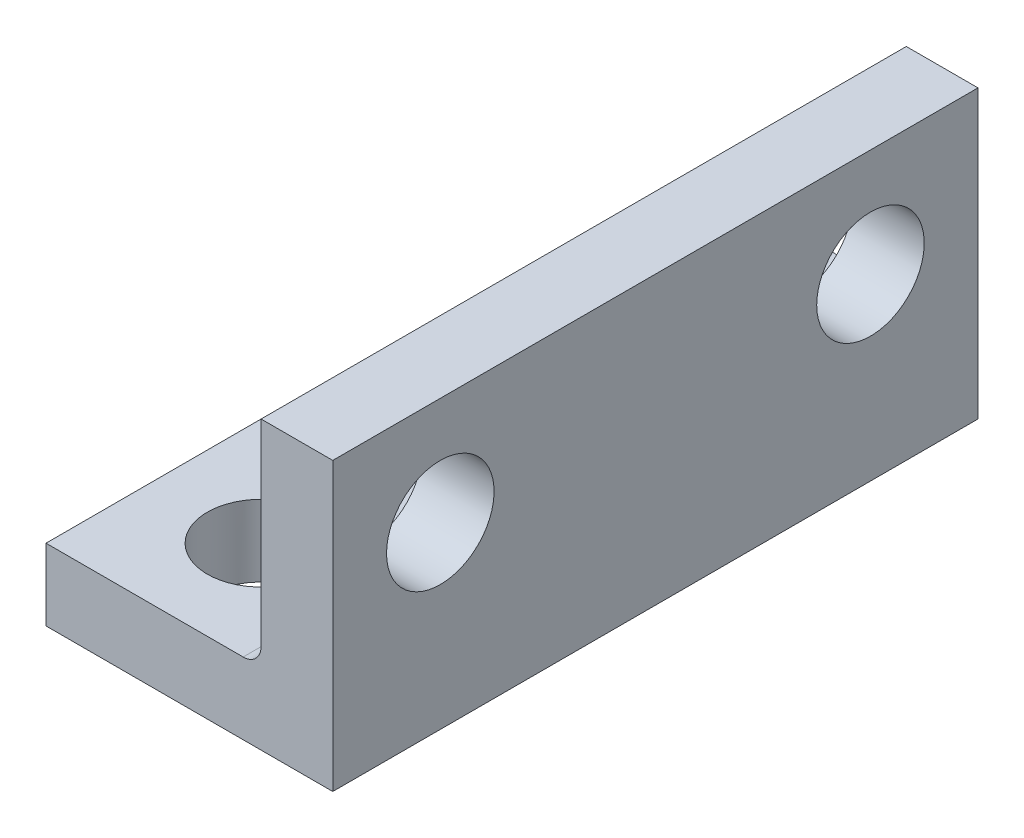
ISO-10303-21;
HEADER;
FILE_DESCRIPTION(('STEP AP214'),'2;1');
FILE_NAME('part.step','',(''),(''),'','','');
FILE_SCHEMA(('AUTOMOTIVE_DESIGN { 1 0 10303 214 1 1 1 1 }'));
ENDSEC;
DATA;
#1=APPLICATION_CONTEXT('core data for automotive mechanical design processes');
#2=APPLICATION_PROTOCOL_DEFINITION('international standard','automotive_design',2000,#1);
#3=PRODUCT_CONTEXT('',#1,'mechanical');
#4=PRODUCT('Part','Part','',(#3));
#5=PRODUCT_RELATED_PRODUCT_CATEGORY('part','',(#4));
#6=PRODUCT_DEFINITION_FORMATION('','',#4);
#7=PRODUCT_DEFINITION_CONTEXT('part definition',#1,'design');
#8=PRODUCT_DEFINITION('design','',#6,#7);
#9=PRODUCT_DEFINITION_SHAPE('','',#8);
#10=(LENGTH_UNIT() NAMED_UNIT(*) SI_UNIT(.MILLI.,.METRE.));
#11=(NAMED_UNIT(*) PLANE_ANGLE_UNIT() SI_UNIT($,.RADIAN.));
#12=(NAMED_UNIT(*) SI_UNIT($,.STERADIAN.) SOLID_ANGLE_UNIT());
#13=UNCERTAINTY_MEASURE_WITH_UNIT(LENGTH_MEASURE(1.E-05),#10,'distance_accuracy_value','');
#14=(GEOMETRIC_REPRESENTATION_CONTEXT(3) GLOBAL_UNCERTAINTY_ASSIGNED_CONTEXT((#13)) GLOBAL_UNIT_ASSIGNED_CONTEXT((#10,
#11,#12)) REPRESENTATION_CONTEXT('',''));
#15=CARTESIAN_POINT('',(0.,0.,0.));
#16=DIRECTION('',(0.,0.,1.));
#17=DIRECTION('',(1.,0.,0.));
#18=AXIS2_PLACEMENT_3D('',#15,#16,#17);
#19=CARTESIAN_POINT('',(0.,0.,18.));
#20=DIRECTION('',(-1.,0.,0.));
#21=DIRECTION('',(0.,0.,1.));
#22=AXIS2_PLACEMENT_3D('',#19,#20,#21);
#23=PLANE('',#22);
#24=CARTESIAN_POINT('',(0.,5.,15.));
#25=DIRECTION('',(-1.,0.,0.));
#26=DIRECTION('',(0.,0.,1.));
#27=AXIS2_PLACEMENT_3D('',#24,#25,#26);
#28=CIRCLE('',#27,1.5);
#29=CARTESIAN_POINT('',(0.,5.,16.5));
#30=VERTEX_POINT('',#29);
#31=EDGE_CURVE('E151',#30,#30,#28,.T.);
#32=ORIENTED_EDGE('',*,*,#31,.T.);
#33=EDGE_LOOP('',(#32));
#34=FACE_BOUND('',#33,.T.);
#35=CARTESIAN_POINT('',(0.,5.,3.));
#36=DIRECTION('',(-1.,0.,0.));
#37=DIRECTION('',(0.,0.,1.));
#38=AXIS2_PLACEMENT_3D('',#35,#36,#37);
#39=CIRCLE('',#38,1.5);
#40=CARTESIAN_POINT('',(0.,5.,4.5));
#41=VERTEX_POINT('',#40);
#42=EDGE_CURVE('E145',#41,#41,#39,.T.);
#43=ORIENTED_EDGE('',*,*,#42,.T.);
#44=EDGE_LOOP('',(#43));
#45=FACE_BOUND('',#44,.T.);
#46=DIRECTION('',(0.,1.,0.));
#47=VECTOR('',#46,1.);
#48=CARTESIAN_POINT('',(0.,0.,0.));
#49=LINE('',#48,#47);
#50=CARTESIAN_POINT('',(0.,0.,0.));
#51=VERTEX_POINT('',#50);
#52=CARTESIAN_POINT('',(0.,8.,0.));
#53=VERTEX_POINT('',#52);
#54=EDGE_CURVE('E129',#51,#53,#49,.T.);
#55=ORIENTED_EDGE('',*,*,#54,.T.);
#56=DIRECTION('',(0.,0.,-1.));
#57=VECTOR('',#56,1.);
#58=CARTESIAN_POINT('',(0.,8.,18.));
#59=LINE('',#58,#57);
#60=CARTESIAN_POINT('',(0.,8.,18.));
#61=VERTEX_POINT('',#60);
#62=EDGE_CURVE('E109',#61,#53,#59,.T.);
#63=ORIENTED_EDGE('',*,*,#62,.F.);
#64=DIRECTION('',(0.,1.,0.));
#65=VECTOR('',#64,1.);
#66=CARTESIAN_POINT('',(0.,0.,18.));
#67=LINE('',#66,#65);
#68=CARTESIAN_POINT('',(0.,0.,18.));
#69=VERTEX_POINT('',#68);
#70=EDGE_CURVE('E116',#69,#61,#67,.T.);
#71=ORIENTED_EDGE('',*,*,#70,.F.);
#72=DIRECTION('',(0.,0.,-1.));
#73=VECTOR('',#72,1.);
#74=CARTESIAN_POINT('',(0.,0.,18.));
#75=LINE('',#74,#73);
#76=EDGE_CURVE('E190',#69,#51,#75,.T.);
#77=ORIENTED_EDGE('',*,*,#76,.T.);
#78=EDGE_LOOP('',(#55,#63,#71,#77));
#79=FACE_BOUND('',#78,.T.);
#80=ADVANCED_FACE('F45',(#34,#45,#79),#23,.F.);
#81=CARTESIAN_POINT('',(0.,8.,18.));
#82=DIRECTION('',(0.,-1.,0.));
#83=DIRECTION('',(0.,0.,-1.));
#84=AXIS2_PLACEMENT_3D('',#81,#82,#83);
#85=PLANE('',#84);
#86=DIRECTION('',(-1.,0.,0.));
#87=VECTOR('',#86,1.);
#88=CARTESIAN_POINT('',(0.,8.,0.));
#89=LINE('',#88,#87);
#90=CARTESIAN_POINT('',(-2.,8.,0.));
#91=VERTEX_POINT('',#90);
#92=EDGE_CURVE('E193',#53,#91,#89,.T.);
#93=ORIENTED_EDGE('',*,*,#92,.T.);
#94=DIRECTION('',(0.,0.,-1.));
#95=VECTOR('',#94,1.);
#96=CARTESIAN_POINT('',(-2.,8.,18.));
#97=LINE('',#96,#95);
#98=CARTESIAN_POINT('',(-2.,8.,18.));
#99=VERTEX_POINT('',#98);
#100=EDGE_CURVE('E112',#99,#91,#97,.T.);
#101=ORIENTED_EDGE('',*,*,#100,.F.);
#102=DIRECTION('',(-1.,0.,0.));
#103=VECTOR('',#102,1.);
#104=CARTESIAN_POINT('',(0.,8.,18.));
#105=LINE('',#104,#103);
#106=EDGE_CURVE('E105',#61,#99,#105,.T.);
#107=ORIENTED_EDGE('',*,*,#106,.F.);
#108=ORIENTED_EDGE('',*,*,#62,.T.);
#109=EDGE_LOOP('',(#93,#101,#107,#108));
#110=FACE_BOUND('',#109,.T.);
#111=ADVANCED_FACE('F107',(#110),#85,.F.);
#112=CARTESIAN_POINT('',(-2.,8.,18.));
#113=DIRECTION('',(1.,0.,0.));
#114=DIRECTION('',(0.,1.,0.));
#115=AXIS2_PLACEMENT_3D('',#112,#113,#114);
#116=PLANE('',#115);
#117=CARTESIAN_POINT('',(-2.,5.,15.));
#118=DIRECTION('',(1.,0.,0.));
#119=DIRECTION('',(0.,1.,0.));
#120=AXIS2_PLACEMENT_3D('',#117,#118,#119);
#121=CIRCLE('',#120,1.5);
#122=CARTESIAN_POINT('',(-2.,6.5,15.));
#123=VERTEX_POINT('',#122);
#124=EDGE_CURVE('E147',#123,#123,#121,.T.);
#125=ORIENTED_EDGE('',*,*,#124,.T.);
#126=EDGE_LOOP('',(#125));
#127=FACE_BOUND('',#126,.T.);
#128=CARTESIAN_POINT('',(-2.,5.,3.));
#129=DIRECTION('',(1.,0.,0.));
#130=DIRECTION('',(0.,1.,0.));
#131=AXIS2_PLACEMENT_3D('',#128,#129,#130);
#132=CIRCLE('',#131,1.5);
#133=CARTESIAN_POINT('',(-2.,6.5,3.));
#134=VERTEX_POINT('',#133);
#135=EDGE_CURVE('E141',#134,#134,#132,.T.);
#136=ORIENTED_EDGE('',*,*,#135,.T.);
#137=EDGE_LOOP('',(#136));
#138=FACE_BOUND('',#137,.T.);
#139=DIRECTION('',(0.,-1.,0.));
#140=VECTOR('',#139,1.);
#141=CARTESIAN_POINT('',(-2.,8.,0.));
#142=LINE('',#141,#140);
#143=CARTESIAN_POINT('',(-2.,2.5,0.));
#144=VERTEX_POINT('',#143);
#145=EDGE_CURVE('E196',#91,#144,#142,.T.);
#146=ORIENTED_EDGE('',*,*,#145,.T.);
#147=DIRECTION('',(0.,0.,-1.));
#148=VECTOR('',#147,1.);
#149=CARTESIAN_POINT('',(-2.,2.5,18.));
#150=LINE('',#149,#148);
#151=CARTESIAN_POINT('',(-2.,2.5,18.));
#152=VERTEX_POINT('',#151);
#153=EDGE_CURVE('E61',#144,#152,#150,.F.);
#154=ORIENTED_EDGE('',*,*,#153,.T.);
#155=DIRECTION('',(0.,-1.,0.));
#156=VECTOR('',#155,1.);
#157=CARTESIAN_POINT('',(-2.,8.,18.));
#158=LINE('',#157,#156);
#159=EDGE_CURVE('E115',#99,#152,#158,.T.);
#160=ORIENTED_EDGE('',*,*,#159,.F.);
#161=ORIENTED_EDGE('',*,*,#100,.T.);
#162=EDGE_LOOP('',(#146,#154,#160,#161));
#163=FACE_BOUND('',#162,.T.);
#164=ADVANCED_FACE('F245',(#127,#138,#163),#116,.F.);
#165=CARTESIAN_POINT('',(-8.,2.,18.));
#166=DIRECTION('',(0.,-1.,0.));
#167=DIRECTION('',(1.,0.,0.));
#168=AXIS2_PLACEMENT_3D('',#165,#166,#167);
#169=PLANE('',#168);
#170=CARTESIAN_POINT('',(-5.,2.,15.));
#171=DIRECTION('',(0.,-1.,0.));
#172=DIRECTION('',(1.,0.,0.));
#173=AXIS2_PLACEMENT_3D('',#170,#171,#172);
#174=CIRCLE('',#173,1.5);
#175=CARTESIAN_POINT('',(-3.5,2.,15.));
#176=VERTEX_POINT('',#175);
#177=EDGE_CURVE('E146',#176,#176,#174,.T.);
#178=ORIENTED_EDGE('',*,*,#177,.T.);
#179=EDGE_LOOP('',(#178));
#180=FACE_BOUND('',#179,.T.);
#181=CARTESIAN_POINT('',(-5.,2.,3.));
#182=DIRECTION('',(0.,-1.,0.));
#183=DIRECTION('',(1.,0.,0.));
#184=AXIS2_PLACEMENT_3D('',#181,#182,#183);
#185=CIRCLE('',#184,1.5);
#186=CARTESIAN_POINT('',(-3.5,2.,3.));
#187=VERTEX_POINT('',#186);
#188=EDGE_CURVE('E156',#187,#187,#185,.T.);
#189=ORIENTED_EDGE('',*,*,#188,.T.);
#190=EDGE_LOOP('',(#189));
#191=FACE_BOUND('',#190,.T.);
#192=DIRECTION('',(-1.,0.,0.));
#193=VECTOR('',#192,1.);
#194=CARTESIAN_POINT('',(-8.,2.,18.));
#195=LINE('',#194,#193);
#196=CARTESIAN_POINT('',(-2.5,2.,18.));
#197=VERTEX_POINT('',#196);
#198=CARTESIAN_POINT('',(-8.,2.,18.));
#199=VERTEX_POINT('',#198);
#200=EDGE_CURVE('E182',#197,#199,#195,.T.);
#201=ORIENTED_EDGE('',*,*,#200,.F.);
#202=DIRECTION('',(0.,0.,-1.));
#203=VECTOR('',#202,1.);
#204=CARTESIAN_POINT('',(-2.5,2.,0.));
#205=LINE('',#204,#203);
#206=CARTESIAN_POINT('',(-2.5,2.,0.));
#207=VERTEX_POINT('',#206);
#208=EDGE_CURVE('E131',#197,#207,#205,.T.);
#209=ORIENTED_EDGE('',*,*,#208,.T.);
#210=DIRECTION('',(-1.,0.,0.));
#211=VECTOR('',#210,1.);
#212=CARTESIAN_POINT('',(-8.,2.,0.));
#213=LINE('',#212,#211);
#214=CARTESIAN_POINT('',(-8.,2.,0.));
#215=VERTEX_POINT('',#214);
#216=EDGE_CURVE('E199',#207,#215,#213,.T.);
#217=ORIENTED_EDGE('',*,*,#216,.T.);
#218=DIRECTION('',(0.,0.,-1.));
#219=VECTOR('',#218,1.);
#220=CARTESIAN_POINT('',(-8.,2.,18.));
#221=LINE('',#220,#219);
#222=EDGE_CURVE('E137',#199,#215,#221,.T.);
#223=ORIENTED_EDGE('',*,*,#222,.F.);
#224=EDGE_LOOP('',(#201,#209,#217,#223));
#225=FACE_BOUND('',#224,.T.);
#226=ADVANCED_FACE('F235',(#180,#191,#225),#169,.F.);
#227=CARTESIAN_POINT('',(-8.,0.,18.));
#228=DIRECTION('',(1.,0.,0.));
#229=DIRECTION('',(0.,0.,-1.));
#230=AXIS2_PLACEMENT_3D('',#227,#228,#229);
#231=PLANE('',#230);
#232=DIRECTION('',(0.,-1.,0.));
#233=VECTOR('',#232,1.);
#234=CARTESIAN_POINT('',(-8.,0.,0.));
#235=LINE('',#234,#233);
#236=CARTESIAN_POINT('',(-8.,0.,0.));
#237=VERTEX_POINT('',#236);
#238=EDGE_CURVE('E202',#215,#237,#235,.T.);
#239=ORIENTED_EDGE('',*,*,#238,.T.);
#240=DIRECTION('',(0.,0.,-1.));
#241=VECTOR('',#240,1.);
#242=CARTESIAN_POINT('',(-8.,0.,18.));
#243=LINE('',#242,#241);
#244=CARTESIAN_POINT('',(-8.,0.,18.));
#245=VERTEX_POINT('',#244);
#246=EDGE_CURVE('E209',#245,#237,#243,.T.);
#247=ORIENTED_EDGE('',*,*,#246,.F.);
#248=DIRECTION('',(0.,-1.,0.));
#249=VECTOR('',#248,1.);
#250=CARTESIAN_POINT('',(-8.,0.,18.));
#251=LINE('',#250,#249);
#252=EDGE_CURVE('E185',#199,#245,#251,.T.);
#253=ORIENTED_EDGE('',*,*,#252,.F.);
#254=ORIENTED_EDGE('',*,*,#222,.T.);
#255=EDGE_LOOP('',(#239,#247,#253,#254));
#256=FACE_BOUND('',#255,.T.);
#257=ADVANCED_FACE('F218',(#256),#231,.F.);
#258=CARTESIAN_POINT('',(0.,0.,18.));
#259=DIRECTION('',(0.,1.,0.));
#260=DIRECTION('',(-1.,0.,0.));
#261=AXIS2_PLACEMENT_3D('',#258,#259,#260);
#262=PLANE('',#261);
#263=CARTESIAN_POINT('',(-5.,0.,15.));
#264=DIRECTION('',(0.,1.,0.));
#265=DIRECTION('',(-1.,0.,0.));
#266=AXIS2_PLACEMENT_3D('',#263,#264,#265);
#267=CIRCLE('',#266,1.5);
#268=CARTESIAN_POINT('',(-6.5,0.,15.));
#269=VERTEX_POINT('',#268);
#270=EDGE_CURVE('E157',#269,#269,#267,.T.);
#271=ORIENTED_EDGE('',*,*,#270,.T.);
#272=EDGE_LOOP('',(#271));
#273=FACE_BOUND('',#272,.T.);
#274=CARTESIAN_POINT('',(-5.,0.,3.));
#275=DIRECTION('',(0.,1.,0.));
#276=DIRECTION('',(-1.,0.,0.));
#277=AXIS2_PLACEMENT_3D('',#274,#275,#276);
#278=CIRCLE('',#277,1.5);
#279=CARTESIAN_POINT('',(-6.5,0.,3.));
#280=VERTEX_POINT('',#279);
#281=EDGE_CURVE('E152',#280,#280,#278,.T.);
#282=ORIENTED_EDGE('',*,*,#281,.T.);
#283=EDGE_LOOP('',(#282));
#284=FACE_BOUND('',#283,.T.);
#285=DIRECTION('',(1.,0.,0.));
#286=VECTOR('',#285,1.);
#287=CARTESIAN_POINT('',(0.,0.,0.));
#288=LINE('',#287,#286);
#289=EDGE_CURVE('E126',#237,#51,#288,.T.);
#290=ORIENTED_EDGE('',*,*,#289,.T.);
#291=ORIENTED_EDGE('',*,*,#76,.F.);
#292=DIRECTION('',(1.,0.,0.));
#293=VECTOR('',#292,1.);
#294=CARTESIAN_POINT('',(0.,0.,18.));
#295=LINE('',#294,#293);
#296=EDGE_CURVE('E121',#245,#69,#295,.T.);
#297=ORIENTED_EDGE('',*,*,#296,.F.);
#298=ORIENTED_EDGE('',*,*,#246,.T.);
#299=EDGE_LOOP('',(#290,#291,#297,#298));
#300=FACE_BOUND('',#299,.T.);
#301=ADVANCED_FACE('F225',(#273,#284,#300),#262,.F.);
#302=CARTESIAN_POINT('',(0.,0.,18.));
#303=DIRECTION('',(0.,0.,1.));
#304=DIRECTION('',(1.,0.,0.));
#305=AXIS2_PLACEMENT_3D('',#302,#303,#304);
#306=PLANE('',#305);
#307=ORIENTED_EDGE('',*,*,#70,.T.);
#308=ORIENTED_EDGE('',*,*,#106,.T.);
#309=ORIENTED_EDGE('',*,*,#159,.T.);
#310=CARTESIAN_POINT('',(-2.5,2.5,18.));
#311=DIRECTION('',(0.,0.,1.));
#312=DIRECTION('',(1.,0.,0.));
#313=AXIS2_PLACEMENT_3D('',#310,#311,#312);
#314=CIRCLE('',#313,0.5);
#315=EDGE_CURVE('E11',#152,#197,#314,.F.);
#316=ORIENTED_EDGE('',*,*,#315,.T.);
#317=ORIENTED_EDGE('',*,*,#200,.T.);
#318=ORIENTED_EDGE('',*,*,#252,.T.);
#319=ORIENTED_EDGE('',*,*,#296,.T.);
#320=EDGE_LOOP('',(#307,#308,#309,#316,#317,#318,#319));
#321=FACE_BOUND('',#320,.T.);
#322=ADVANCED_FACE('F119',(#321),#306,.T.);
#323=CARTESIAN_POINT('',(0.,0.,0.));
#324=DIRECTION('',(0.,0.,1.));
#325=DIRECTION('',(1.,0.,0.));
#326=AXIS2_PLACEMENT_3D('',#323,#324,#325);
#327=PLANE('',#326);
#328=ORIENTED_EDGE('',*,*,#54,.F.);
#329=ORIENTED_EDGE('',*,*,#289,.F.);
#330=ORIENTED_EDGE('',*,*,#238,.F.);
#331=ORIENTED_EDGE('',*,*,#216,.F.);
#332=CARTESIAN_POINT('',(-2.5,2.5,0.));
#333=DIRECTION('',(0.,0.,1.));
#334=DIRECTION('',(1.,0.,0.));
#335=AXIS2_PLACEMENT_3D('',#332,#333,#334);
#336=CIRCLE('',#335,0.5);
#337=EDGE_CURVE('E54',#207,#144,#336,.T.);
#338=ORIENTED_EDGE('',*,*,#337,.T.);
#339=ORIENTED_EDGE('',*,*,#145,.F.);
#340=ORIENTED_EDGE('',*,*,#92,.F.);
#341=EDGE_LOOP('',(#328,#329,#330,#331,#338,#339,#340));
#342=FACE_BOUND('',#341,.T.);
#343=ADVANCED_FACE('F223',(#342),#327,.F.);
#344=CARTESIAN_POINT('',(-8.,5.,3.));
#345=DIRECTION('',(1.,0.,0.));
#346=DIRECTION('',(0.,0.,-1.));
#347=AXIS2_PLACEMENT_3D('',#344,#345,#346);
#348=CYLINDRICAL_SURFACE('',#347,1.5);
#349=ORIENTED_EDGE('',*,*,#135,.F.);
#350=EDGE_LOOP('',(#349));
#351=FACE_BOUND('',#350,.T.);
#352=ORIENTED_EDGE('',*,*,#42,.F.);
#353=EDGE_LOOP('',(#352));
#354=FACE_BOUND('',#353,.T.);
#355=ADVANCED_FACE('F277',(#351,#354),#348,.F.);
#356=CARTESIAN_POINT('',(-8.,5.,15.));
#357=DIRECTION('',(1.,0.,0.));
#358=DIRECTION('',(0.,0.,-1.));
#359=AXIS2_PLACEMENT_3D('',#356,#357,#358);
#360=CYLINDRICAL_SURFACE('',#359,1.5);
#361=ORIENTED_EDGE('',*,*,#124,.F.);
#362=EDGE_LOOP('',(#361));
#363=FACE_BOUND('',#362,.T.);
#364=ORIENTED_EDGE('',*,*,#31,.F.);
#365=EDGE_LOOP('',(#364));
#366=FACE_BOUND('',#365,.T.);
#367=ADVANCED_FACE('F271',(#363,#366),#360,.F.);
#368=CARTESIAN_POINT('',(-5.,8.,3.));
#369=DIRECTION('',(0.,-1.,0.));
#370=DIRECTION('',(1.,0.,0.));
#371=AXIS2_PLACEMENT_3D('',#368,#369,#370);
#372=CYLINDRICAL_SURFACE('',#371,1.5);
#373=ORIENTED_EDGE('',*,*,#281,.F.);
#374=EDGE_LOOP('',(#373));
#375=FACE_BOUND('',#374,.T.);
#376=ORIENTED_EDGE('',*,*,#188,.F.);
#377=EDGE_LOOP('',(#376));
#378=FACE_BOUND('',#377,.T.);
#379=ADVANCED_FACE('F266',(#375,#378),#372,.F.);
#380=CARTESIAN_POINT('',(-5.,8.,15.));
#381=DIRECTION('',(0.,-1.,0.));
#382=DIRECTION('',(1.,0.,0.));
#383=AXIS2_PLACEMENT_3D('',#380,#381,#382);
#384=CYLINDRICAL_SURFACE('',#383,1.5);
#385=ORIENTED_EDGE('',*,*,#270,.F.);
#386=EDGE_LOOP('',(#385));
#387=FACE_BOUND('',#386,.T.);
#388=ORIENTED_EDGE('',*,*,#177,.F.);
#389=EDGE_LOOP('',(#388));
#390=FACE_BOUND('',#389,.T.);
#391=ADVANCED_FACE('F261',(#387,#390),#384,.F.);
#392=CARTESIAN_POINT('',(-2.5,2.5,18.));
#393=DIRECTION('',(0.,0.,1.));
#394=DIRECTION('',(1.,0.,0.));
#395=AXIS2_PLACEMENT_3D('',#392,#393,#394);
#396=CYLINDRICAL_SURFACE('',#395,0.5);
#397=ORIENTED_EDGE('',*,*,#315,.F.);
#398=ORIENTED_EDGE('',*,*,#153,.F.);
#399=ORIENTED_EDGE('',*,*,#337,.F.);
#400=ORIENTED_EDGE('',*,*,#208,.F.);
#401=EDGE_LOOP('',(#397,#398,#399,#400));
#402=FACE_BOUND('',#401,.T.);
#403=ADVANCED_FACE('F47',(#402),#396,.F.);
#404=CLOSED_SHELL('',(#80,#111,#164,#226,#257,#301,#322,#343,#355,#367,#379,#391,#403));
#405=MANIFOLD_SOLID_BREP('B2',#404);
#406=ADVANCED_BREP_SHAPE_REPRESENTATION('',(#18,#405),#14);
#407=SHAPE_DEFINITION_REPRESENTATION(#9,#406);
ENDSEC;
END-ISO-10303-21;
